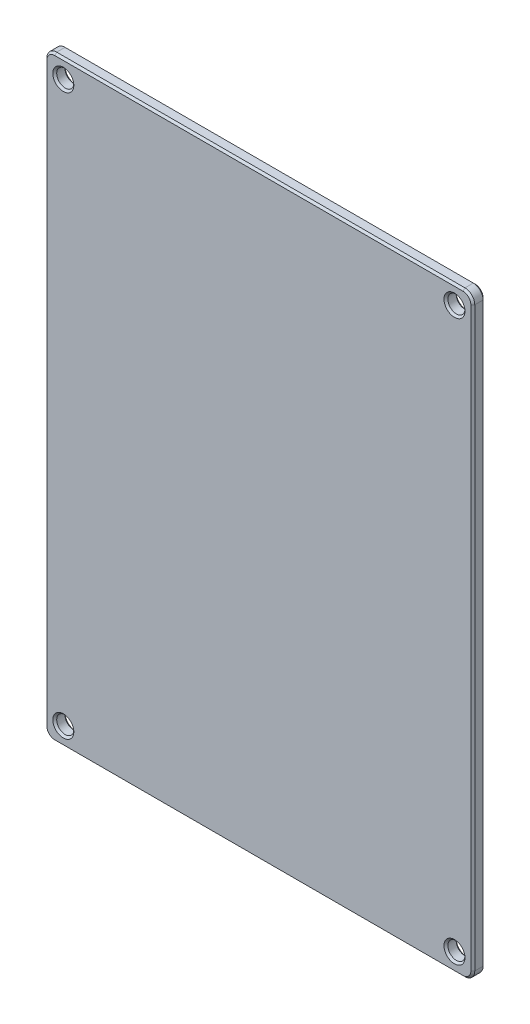
ISO-10303-21;
HEADER;
FILE_DESCRIPTION(('STEP AP214'),'2;1');
FILE_NAME('part.step','',(''),(''),'','','');
FILE_SCHEMA(('AUTOMOTIVE_DESIGN { 1 0 10303 214 1 1 1 1 }'));
ENDSEC;
DATA;
#1=APPLICATION_CONTEXT('core data for automotive mechanical design processes');
#2=APPLICATION_PROTOCOL_DEFINITION('international standard','automotive_design',2000,#1);
#3=PRODUCT_CONTEXT('',#1,'mechanical');
#4=PRODUCT('Part','Part','',(#3));
#5=PRODUCT_RELATED_PRODUCT_CATEGORY('part','',(#4));
#6=PRODUCT_DEFINITION_FORMATION('','',#4);
#7=PRODUCT_DEFINITION_CONTEXT('part definition',#1,'design');
#8=PRODUCT_DEFINITION('design','',#6,#7);
#9=PRODUCT_DEFINITION_SHAPE('','',#8);
#10=(LENGTH_UNIT() NAMED_UNIT(*) SI_UNIT(.MILLI.,.METRE.));
#11=(NAMED_UNIT(*) PLANE_ANGLE_UNIT() SI_UNIT($,.RADIAN.));
#12=(NAMED_UNIT(*) SI_UNIT($,.STERADIAN.) SOLID_ANGLE_UNIT());
#13=UNCERTAINTY_MEASURE_WITH_UNIT(LENGTH_MEASURE(1.E-05),#10,'distance_accuracy_value','');
#14=(GEOMETRIC_REPRESENTATION_CONTEXT(3) GLOBAL_UNCERTAINTY_ASSIGNED_CONTEXT((#13)) GLOBAL_UNIT_ASSIGNED_CONTEXT((#10,
#11,#12)) REPRESENTATION_CONTEXT('',''));
#15=CARTESIAN_POINT('',(0.,0.,0.));
#16=DIRECTION('',(0.,0.,1.));
#17=DIRECTION('',(1.,0.,0.));
#18=AXIS2_PLACEMENT_3D('',#15,#16,#17);
#19=CARTESIAN_POINT('',(41.75,-59.,2.5));
#20=DIRECTION('',(0.,0.,-1.));
#21=DIRECTION('',(-1.,0.,0.));
#22=AXIS2_PLACEMENT_3D('',#19,#20,#21);
#23=PLANE('',#22);
#24=CARTESIAN_POINT('',(40.,-57.25,2.5));
#25=DIRECTION('',(0.,0.,-1.));
#26=DIRECTION('',(-1.,0.,0.));
#27=AXIS2_PLACEMENT_3D('',#24,#25,#26);
#28=CIRCLE('',#27,2.15000000000003);
#29=CARTESIAN_POINT('',(37.85,-57.25,2.5));
#30=VERTEX_POINT('',#29);
#31=EDGE_CURVE('E198',#30,#30,#28,.T.);
#32=ORIENTED_EDGE('',*,*,#31,.T.);
#33=EDGE_LOOP('',(#32));
#34=FACE_BOUND('',#33,.T.);
#35=CARTESIAN_POINT('',(40.,57.25,2.5));
#36=DIRECTION('',(0.,0.,-1.));
#37=DIRECTION('',(-1.,0.,0.));
#38=AXIS2_PLACEMENT_3D('',#35,#36,#37);
#39=CIRCLE('',#38,2.15000000000003);
#40=CARTESIAN_POINT('',(37.85,57.25,2.5));
#41=VERTEX_POINT('',#40);
#42=EDGE_CURVE('E193',#41,#41,#39,.T.);
#43=ORIENTED_EDGE('',*,*,#42,.T.);
#44=EDGE_LOOP('',(#43));
#45=FACE_BOUND('',#44,.T.);
#46=CARTESIAN_POINT('',(-40.,-57.25,2.5));
#47=DIRECTION('',(0.,0.,-1.));
#48=DIRECTION('',(-1.,0.,0.));
#49=AXIS2_PLACEMENT_3D('',#46,#47,#48);
#50=CIRCLE('',#49,2.15000000000003);
#51=CARTESIAN_POINT('',(-42.15,-57.25,2.5));
#52=VERTEX_POINT('',#51);
#53=EDGE_CURVE('E183',#52,#52,#50,.T.);
#54=ORIENTED_EDGE('',*,*,#53,.T.);
#55=EDGE_LOOP('',(#54));
#56=FACE_BOUND('',#55,.T.);
#57=CARTESIAN_POINT('',(-40.,57.25,2.5));
#58=DIRECTION('',(0.,0.,-1.));
#59=DIRECTION('',(-1.,0.,0.));
#60=AXIS2_PLACEMENT_3D('',#57,#58,#59);
#61=CIRCLE('',#60,2.14999999999999);
#62=CARTESIAN_POINT('',(-42.15,57.25,2.5));
#63=VERTEX_POINT('',#62);
#64=EDGE_CURVE('E185',#63,#63,#61,.T.);
#65=ORIENTED_EDGE('',*,*,#64,.T.);
#66=EDGE_LOOP('',(#65));
#67=FACE_BOUND('',#66,.T.);
#68=CARTESIAN_POINT('',(-41.7499999999999,-59.,2.5));
#69=DIRECTION('',(0.,0.,-1.));
#70=DIRECTION('',(-1.,0.,0.));
#71=AXIS2_PLACEMENT_3D('',#68,#69,#70);
#72=CIRCLE('',#71,1.59999999999998);
#73=CARTESIAN_POINT('',(-43.3499999999999,-59.,2.5));
#74=VERTEX_POINT('',#73);
#75=CARTESIAN_POINT('',(-41.7499999999999,-60.6,2.5));
#76=VERTEX_POINT('',#75);
#77=EDGE_CURVE('E179',#74,#76,#72,.F.);
#78=ORIENTED_EDGE('',*,*,#77,.T.);
#79=DIRECTION('',(1.,0.,0.));
#80=VECTOR('',#79,1.);
#81=CARTESIAN_POINT('',(41.75,-60.5999999999999,2.5));
#82=LINE('',#81,#80);
#83=CARTESIAN_POINT('',(41.75,-60.5999999999999,2.5));
#84=VERTEX_POINT('',#83);
#85=EDGE_CURVE('E165',#76,#84,#82,.T.);
#86=ORIENTED_EDGE('',*,*,#85,.T.);
#87=CARTESIAN_POINT('',(41.75,-59.,2.5));
#88=DIRECTION('',(0.,0.,-1.));
#89=DIRECTION('',(-1.,0.,0.));
#90=AXIS2_PLACEMENT_3D('',#87,#88,#89);
#91=CIRCLE('',#90,1.59999999999996);
#92=CARTESIAN_POINT('',(43.35,-59.,2.5));
#93=VERTEX_POINT('',#92);
#94=EDGE_CURVE('E168',#84,#93,#91,.F.);
#95=ORIENTED_EDGE('',*,*,#94,.T.);
#96=DIRECTION('',(0.,1.,0.));
#97=VECTOR('',#96,1.);
#98=CARTESIAN_POINT('',(43.35,-59.,2.5));
#99=LINE('',#98,#97);
#100=CARTESIAN_POINT('',(43.35,59.,2.5));
#101=VERTEX_POINT('',#100);
#102=EDGE_CURVE('E176',#93,#101,#99,.T.);
#103=ORIENTED_EDGE('',*,*,#102,.T.);
#104=CARTESIAN_POINT('',(41.75,59.,2.5));
#105=DIRECTION('',(0.,0.,-1.));
#106=DIRECTION('',(-1.,0.,0.));
#107=AXIS2_PLACEMENT_3D('',#104,#105,#106);
#108=CIRCLE('',#107,1.59999999999998);
#109=CARTESIAN_POINT('',(41.75,60.6,2.5));
#110=VERTEX_POINT('',#109);
#111=EDGE_CURVE('E357',#101,#110,#108,.F.);
#112=ORIENTED_EDGE('',*,*,#111,.T.);
#113=DIRECTION('',(-1.,0.,0.));
#114=VECTOR('',#113,1.);
#115=CARTESIAN_POINT('',(41.75,60.6,2.5));
#116=LINE('',#115,#114);
#117=CARTESIAN_POINT('',(-41.75,60.6,2.5));
#118=VERTEX_POINT('',#117);
#119=EDGE_CURVE('E363',#110,#118,#116,.T.);
#120=ORIENTED_EDGE('',*,*,#119,.T.);
#121=CARTESIAN_POINT('',(-41.75,59.,2.5));
#122=DIRECTION('',(0.,0.,-1.));
#123=DIRECTION('',(-1.,0.,0.));
#124=AXIS2_PLACEMENT_3D('',#121,#122,#123);
#125=CIRCLE('',#124,1.59999999999998);
#126=CARTESIAN_POINT('',(-43.3499999999999,59.,2.5));
#127=VERTEX_POINT('',#126);
#128=EDGE_CURVE('E361',#118,#127,#125,.F.);
#129=ORIENTED_EDGE('',*,*,#128,.T.);
#130=DIRECTION('',(0.,-1.,0.));
#131=VECTOR('',#130,1.);
#132=CARTESIAN_POINT('',(-43.3499999999999,-59.,2.5));
#133=LINE('',#132,#131);
#134=EDGE_CURVE('E190',#127,#74,#133,.T.);
#135=ORIENTED_EDGE('',*,*,#134,.T.);
#136=EDGE_LOOP('',(#78,#86,#95,#103,#112,#120,#129,#135));
#137=FACE_BOUND('',#136,.T.);
#138=ADVANCED_FACE('F41',(#34,#45,#56,#67,#137),#23,.F.);
#139=CARTESIAN_POINT('',(41.75,-59.,0.));
#140=DIRECTION('',(0.,0.,-1.));
#141=DIRECTION('',(-1.,0.,0.));
#142=AXIS2_PLACEMENT_3D('',#139,#140,#141);
#143=PLANE('',#142);
#144=CARTESIAN_POINT('',(40.,-57.25,0.));
#145=DIRECTION('',(0.,0.,-1.));
#146=DIRECTION('',(-1.,0.,0.));
#147=AXIS2_PLACEMENT_3D('',#144,#145,#146);
#148=CIRCLE('',#147,2.15000000000001);
#149=CARTESIAN_POINT('',(37.85,-57.25,0.));
#150=VERTEX_POINT('',#149);
#151=EDGE_CURVE('E11',#150,#150,#148,.F.);
#152=ORIENTED_EDGE('',*,*,#151,.T.);
#153=EDGE_LOOP('',(#152));
#154=FACE_BOUND('',#153,.T.);
#155=CARTESIAN_POINT('',(-40.,-57.25,0.));
#156=DIRECTION('',(0.,0.,-1.));
#157=DIRECTION('',(-1.,0.,0.));
#158=AXIS2_PLACEMENT_3D('',#155,#156,#157);
#159=CIRCLE('',#158,2.15000000000001);
#160=CARTESIAN_POINT('',(-42.15,-57.25,0.));
#161=VERTEX_POINT('',#160);
#162=EDGE_CURVE('E51',#161,#161,#159,.F.);
#163=ORIENTED_EDGE('',*,*,#162,.T.);
#164=EDGE_LOOP('',(#163));
#165=FACE_BOUND('',#164,.T.);
#166=CARTESIAN_POINT('',(41.75,59.,0.));
#167=DIRECTION('',(0.,0.,-1.));
#168=DIRECTION('',(-1.,0.,0.));
#169=AXIS2_PLACEMENT_3D('',#166,#167,#168);
#170=CIRCLE('',#169,1.60000000000002);
#171=CARTESIAN_POINT('',(41.75,60.6,0.));
#172=VERTEX_POINT('',#171);
#173=CARTESIAN_POINT('',(43.35,59.,0.));
#174=VERTEX_POINT('',#173);
#175=EDGE_CURVE('E56',#172,#174,#170,.T.);
#176=ORIENTED_EDGE('',*,*,#175,.T.);
#177=DIRECTION('',(0.,-1.,0.));
#178=VECTOR('',#177,1.);
#179=CARTESIAN_POINT('',(43.35,-59.,0.));
#180=LINE('',#179,#178);
#181=CARTESIAN_POINT('',(43.35,-59.,0.));
#182=VERTEX_POINT('',#181);
#183=EDGE_CURVE('E270',#174,#182,#180,.T.);
#184=ORIENTED_EDGE('',*,*,#183,.T.);
#185=CARTESIAN_POINT('',(41.75,-59.,0.));
#186=DIRECTION('',(0.,0.,-1.));
#187=DIRECTION('',(-1.,0.,0.));
#188=AXIS2_PLACEMENT_3D('',#185,#186,#187);
#189=CIRCLE('',#188,1.6);
#190=CARTESIAN_POINT('',(41.75,-60.6,0.));
#191=VERTEX_POINT('',#190);
#192=EDGE_CURVE('E254',#182,#191,#189,.T.);
#193=ORIENTED_EDGE('',*,*,#192,.T.);
#194=DIRECTION('',(-1.,0.,0.));
#195=VECTOR('',#194,1.);
#196=CARTESIAN_POINT('',(-41.7499999999999,-60.6,0.));
#197=LINE('',#196,#195);
#198=CARTESIAN_POINT('',(-41.7499999999999,-60.6,0.));
#199=VERTEX_POINT('',#198);
#200=EDGE_CURVE('E260',#191,#199,#197,.T.);
#201=ORIENTED_EDGE('',*,*,#200,.T.);
#202=CARTESIAN_POINT('',(-41.7499999999999,-59.,0.));
#203=DIRECTION('',(0.,0.,-1.));
#204=DIRECTION('',(-1.,0.,0.));
#205=AXIS2_PLACEMENT_3D('',#202,#203,#204);
#206=CIRCLE('',#205,1.60000000000002);
#207=CARTESIAN_POINT('',(-43.35,-59.,0.));
#208=VERTEX_POINT('',#207);
#209=EDGE_CURVE('E259',#199,#208,#206,.T.);
#210=ORIENTED_EDGE('',*,*,#209,.T.);
#211=DIRECTION('',(0.,1.,0.));
#212=VECTOR('',#211,1.);
#213=CARTESIAN_POINT('',(-43.35,59.,0.));
#214=LINE('',#213,#212);
#215=CARTESIAN_POINT('',(-43.35,59.,0.));
#216=VERTEX_POINT('',#215);
#217=EDGE_CURVE('E261',#208,#216,#214,.T.);
#218=ORIENTED_EDGE('',*,*,#217,.T.);
#219=CARTESIAN_POINT('',(-41.75,59.,0.));
#220=DIRECTION('',(0.,0.,-1.));
#221=DIRECTION('',(-1.,0.,0.));
#222=AXIS2_PLACEMENT_3D('',#219,#220,#221);
#223=CIRCLE('',#222,1.60000000000002);
#224=CARTESIAN_POINT('',(-41.75,60.6,0.));
#225=VERTEX_POINT('',#224);
#226=EDGE_CURVE('E263',#216,#225,#223,.T.);
#227=ORIENTED_EDGE('',*,*,#226,.T.);
#228=DIRECTION('',(1.,0.,0.));
#229=VECTOR('',#228,1.);
#230=CARTESIAN_POINT('',(41.75,60.6,0.));
#231=LINE('',#230,#229);
#232=EDGE_CURVE('E63',#225,#172,#231,.T.);
#233=ORIENTED_EDGE('',*,*,#232,.T.);
#234=EDGE_LOOP('',(#176,#184,#193,#201,#210,#218,#227,#233));
#235=FACE_BOUND('',#234,.T.);
#236=CARTESIAN_POINT('',(-40.,57.25,0.));
#237=DIRECTION('',(0.,0.,-1.));
#238=DIRECTION('',(-1.,0.,0.));
#239=AXIS2_PLACEMENT_3D('',#236,#237,#238);
#240=CIRCLE('',#239,2.14999999999997);
#241=CARTESIAN_POINT('',(-42.15,57.25,0.));
#242=VERTEX_POINT('',#241);
#243=EDGE_CURVE('E252',#242,#242,#240,.F.);
#244=ORIENTED_EDGE('',*,*,#243,.T.);
#245=EDGE_LOOP('',(#244));
#246=FACE_BOUND('',#245,.T.);
#247=CARTESIAN_POINT('',(40.,57.25,0.));
#248=DIRECTION('',(0.,0.,-1.));
#249=DIRECTION('',(-1.,0.,0.));
#250=AXIS2_PLACEMENT_3D('',#247,#248,#249);
#251=CIRCLE('',#250,2.15000000000001);
#252=CARTESIAN_POINT('',(37.85,57.25,0.));
#253=VERTEX_POINT('',#252);
#254=EDGE_CURVE('E247',#253,#253,#251,.F.);
#255=ORIENTED_EDGE('',*,*,#254,.T.);
#256=EDGE_LOOP('',(#255));
#257=FACE_BOUND('',#256,.T.);
#258=ADVANCED_FACE('F321',(#154,#165,#235,#246,#257),#143,.T.);
#259=CARTESIAN_POINT('',(41.75,-59.,2.5));
#260=DIRECTION('',(0.,0.,-1.));
#261=DIRECTION('',(-1.,0.,0.));
#262=AXIS2_PLACEMENT_3D('',#259,#260,#261);
#263=CYLINDRICAL_SURFACE('',#262,1.99999999999999);
#264=DIRECTION('',(0.,0.,-1.));
#265=VECTOR('',#264,1.);
#266=CARTESIAN_POINT('',(43.75,-59.,2.5));
#267=LINE('',#266,#265);
#268=CARTESIAN_POINT('',(43.75,-59.,2.09999999999997));
#269=VERTEX_POINT('',#268);
#270=CARTESIAN_POINT('',(43.75,-59.,0.400000000000011));
#271=VERTEX_POINT('',#270);
#272=EDGE_CURVE('E339',#269,#271,#267,.T.);
#273=ORIENTED_EDGE('',*,*,#272,.F.);
#274=CARTESIAN_POINT('',(41.75,-59.,2.09999999999997));
#275=DIRECTION('',(0.,0.,-1.));
#276=DIRECTION('',(-1.,0.,0.));
#277=AXIS2_PLACEMENT_3D('',#274,#275,#276);
#278=CIRCLE('',#277,1.99999999999999);
#279=CARTESIAN_POINT('',(41.75,-61.,2.09999999999997));
#280=VERTEX_POINT('',#279);
#281=EDGE_CURVE('E250',#269,#280,#278,.T.);
#282=ORIENTED_EDGE('',*,*,#281,.T.);
#283=DIRECTION('',(0.,0.,-1.));
#284=VECTOR('',#283,1.);
#285=CARTESIAN_POINT('',(41.75,-61.,2.5));
#286=LINE('',#285,#284);
#287=CARTESIAN_POINT('',(41.75,-61.,0.400000000000011));
#288=VERTEX_POINT('',#287);
#289=EDGE_CURVE('E288',#280,#288,#286,.T.);
#290=ORIENTED_EDGE('',*,*,#289,.T.);
#291=CARTESIAN_POINT('',(41.75,-59.,0.400000000000011));
#292=DIRECTION('',(0.,0.,-1.));
#293=DIRECTION('',(-1.,0.,0.));
#294=AXIS2_PLACEMENT_3D('',#291,#292,#293);
#295=CIRCLE('',#294,1.99999999999999);
#296=EDGE_CURVE('E244',#288,#271,#295,.F.);
#297=ORIENTED_EDGE('',*,*,#296,.T.);
#298=EDGE_LOOP('',(#273,#282,#290,#297));
#299=FACE_BOUND('',#298,.T.);
#300=ADVANCED_FACE('F338',(#299),#263,.T.);
#301=CARTESIAN_POINT('',(43.75,59.,2.5));
#302=DIRECTION('',(-1.,0.,0.));
#303=DIRECTION('',(0.,-1.,0.));
#304=AXIS2_PLACEMENT_3D('',#301,#302,#303);
#305=PLANE('',#304);
#306=DIRECTION('',(0.,0.,-1.));
#307=VECTOR('',#306,1.);
#308=CARTESIAN_POINT('',(43.75,59.,2.5));
#309=LINE('',#308,#307);
#310=CARTESIAN_POINT('',(43.75,59.,2.09999999999997));
#311=VERTEX_POINT('',#310);
#312=CARTESIAN_POINT('',(43.75,59.,0.400000000000011));
#313=VERTEX_POINT('',#312);
#314=EDGE_CURVE('E346',#311,#313,#309,.T.);
#315=ORIENTED_EDGE('',*,*,#314,.F.);
#316=DIRECTION('',(0.,-1.,0.));
#317=VECTOR('',#316,1.);
#318=CARTESIAN_POINT('',(43.75,59.,2.09999999999997));
#319=LINE('',#318,#317);
#320=EDGE_CURVE('E242',#311,#269,#319,.T.);
#321=ORIENTED_EDGE('',*,*,#320,.T.);
#322=ORIENTED_EDGE('',*,*,#272,.T.);
#323=DIRECTION('',(0.,1.,0.));
#324=VECTOR('',#323,1.);
#325=CARTESIAN_POINT('',(43.75,59.,0.400000000000011));
#326=LINE('',#325,#324);
#327=EDGE_CURVE('E238',#271,#313,#326,.T.);
#328=ORIENTED_EDGE('',*,*,#327,.T.);
#329=EDGE_LOOP('',(#315,#321,#322,#328));
#330=FACE_BOUND('',#329,.T.);
#331=ADVANCED_FACE('F342',(#330),#305,.F.);
#332=CARTESIAN_POINT('',(41.75,59.,2.5));
#333=DIRECTION('',(0.,0.,-1.));
#334=DIRECTION('',(-1.,0.,0.));
#335=AXIS2_PLACEMENT_3D('',#332,#333,#334);
#336=CYLINDRICAL_SURFACE('',#335,2.00000000000001);
#337=DIRECTION('',(0.,0.,-1.));
#338=VECTOR('',#337,1.);
#339=CARTESIAN_POINT('',(41.75,61.,2.5));
#340=LINE('',#339,#338);
#341=CARTESIAN_POINT('',(41.75,61.,2.09999999999997));
#342=VERTEX_POINT('',#341);
#343=CARTESIAN_POINT('',(41.75,61.,0.400000000000011));
#344=VERTEX_POINT('',#343);
#345=EDGE_CURVE('E355',#342,#344,#340,.T.);
#346=ORIENTED_EDGE('',*,*,#345,.F.);
#347=CARTESIAN_POINT('',(41.75,59.,2.09999999999997));
#348=DIRECTION('',(0.,0.,-1.));
#349=DIRECTION('',(-1.,0.,0.));
#350=AXIS2_PLACEMENT_3D('',#347,#348,#349);
#351=CIRCLE('',#350,2.00000000000001);
#352=EDGE_CURVE('E236',#342,#311,#351,.T.);
#353=ORIENTED_EDGE('',*,*,#352,.T.);
#354=ORIENTED_EDGE('',*,*,#314,.T.);
#355=CARTESIAN_POINT('',(41.75,59.,0.400000000000011));
#356=DIRECTION('',(0.,0.,-1.));
#357=DIRECTION('',(-1.,0.,0.));
#358=AXIS2_PLACEMENT_3D('',#355,#356,#357);
#359=CIRCLE('',#358,2.00000000000001);
#360=EDGE_CURVE('E237',#313,#344,#359,.F.);
#361=ORIENTED_EDGE('',*,*,#360,.T.);
#362=EDGE_LOOP('',(#346,#353,#354,#361));
#363=FACE_BOUND('',#362,.T.);
#364=ADVANCED_FACE('F447',(#363),#336,.T.);
#365=CARTESIAN_POINT('',(41.75,61.,2.5));
#366=DIRECTION('',(0.,-1.,0.));
#367=DIRECTION('',(0.,0.,-1.));
#368=AXIS2_PLACEMENT_3D('',#365,#366,#367);
#369=PLANE('',#368);
#370=DIRECTION('',(0.,0.,-1.));
#371=VECTOR('',#370,1.);
#372=CARTESIAN_POINT('',(-41.75,61.,2.5));
#373=LINE('',#372,#371);
#374=CARTESIAN_POINT('',(-41.75,61.,2.09999999999997));
#375=VERTEX_POINT('',#374);
#376=CARTESIAN_POINT('',(-41.75,61.,0.400000000000011));
#377=VERTEX_POINT('',#376);
#378=EDGE_CURVE('E391',#375,#377,#373,.T.);
#379=ORIENTED_EDGE('',*,*,#378,.F.);
#380=DIRECTION('',(1.,0.,0.));
#381=VECTOR('',#380,1.);
#382=CARTESIAN_POINT('',(41.75,61.,2.09999999999997));
#383=LINE('',#382,#381);
#384=EDGE_CURVE('E232',#375,#342,#383,.T.);
#385=ORIENTED_EDGE('',*,*,#384,.T.);
#386=ORIENTED_EDGE('',*,*,#345,.T.);
#387=DIRECTION('',(-1.,0.,0.));
#388=VECTOR('',#387,1.);
#389=CARTESIAN_POINT('',(-41.75,61.,0.400000000000011));
#390=LINE('',#389,#388);
#391=EDGE_CURVE('E235',#344,#377,#390,.T.);
#392=ORIENTED_EDGE('',*,*,#391,.T.);
#393=EDGE_LOOP('',(#379,#385,#386,#392));
#394=FACE_BOUND('',#393,.T.);
#395=ADVANCED_FACE('F398',(#394),#369,.F.);
#396=CARTESIAN_POINT('',(-41.75,59.,2.5));
#397=DIRECTION('',(0.,0.,-1.));
#398=DIRECTION('',(-1.,0.,0.));
#399=AXIS2_PLACEMENT_3D('',#396,#397,#398);
#400=CYLINDRICAL_SURFACE('',#399,2.00000000000001);
#401=DIRECTION('',(0.,0.,-1.));
#402=VECTOR('',#401,1.);
#403=CARTESIAN_POINT('',(-43.75,59.,2.5));
#404=LINE('',#403,#402);
#405=CARTESIAN_POINT('',(-43.75,59.,2.09999999999997));
#406=VERTEX_POINT('',#405);
#407=CARTESIAN_POINT('',(-43.75,59.,0.400000000000011));
#408=VERTEX_POINT('',#407);
#409=EDGE_CURVE('E384',#406,#408,#404,.T.);
#410=ORIENTED_EDGE('',*,*,#409,.F.);
#411=CARTESIAN_POINT('',(-41.75,59.,2.09999999999997));
#412=DIRECTION('',(0.,0.,-1.));
#413=DIRECTION('',(-1.,0.,0.));
#414=AXIS2_PLACEMENT_3D('',#411,#412,#413);
#415=CIRCLE('',#414,2.00000000000001);
#416=EDGE_CURVE('E229',#406,#375,#415,.T.);
#417=ORIENTED_EDGE('',*,*,#416,.T.);
#418=ORIENTED_EDGE('',*,*,#378,.T.);
#419=CARTESIAN_POINT('',(-41.75,59.,0.400000000000011));
#420=DIRECTION('',(0.,0.,-1.));
#421=DIRECTION('',(-1.,0.,0.));
#422=AXIS2_PLACEMENT_3D('',#419,#420,#421);
#423=CIRCLE('',#422,2.00000000000001);
#424=EDGE_CURVE('E227',#377,#408,#423,.F.);
#425=ORIENTED_EDGE('',*,*,#424,.T.);
#426=EDGE_LOOP('',(#410,#417,#418,#425));
#427=FACE_BOUND('',#426,.T.);
#428=ADVANCED_FACE('F442',(#427),#400,.T.);
#429=CARTESIAN_POINT('',(-43.75,59.,2.5));
#430=DIRECTION('',(1.,0.,0.));
#431=DIRECTION('',(0.,1.,0.));
#432=AXIS2_PLACEMENT_3D('',#429,#430,#431);
#433=PLANE('',#432);
#434=DIRECTION('',(0.,0.,-1.));
#435=VECTOR('',#434,1.);
#436=CARTESIAN_POINT('',(-43.75,-59.,2.5));
#437=LINE('',#436,#435);
#438=CARTESIAN_POINT('',(-43.75,-59.,2.09999999999997));
#439=VERTEX_POINT('',#438);
#440=CARTESIAN_POINT('',(-43.75,-59.,0.400000000000011));
#441=VERTEX_POINT('',#440);
#442=EDGE_CURVE('E382',#439,#441,#437,.T.);
#443=ORIENTED_EDGE('',*,*,#442,.F.);
#444=DIRECTION('',(0.,1.,0.));
#445=VECTOR('',#444,1.);
#446=CARTESIAN_POINT('',(-43.75,59.,2.09999999999997));
#447=LINE('',#446,#445);
#448=EDGE_CURVE('E226',#439,#406,#447,.T.);
#449=ORIENTED_EDGE('',*,*,#448,.T.);
#450=ORIENTED_EDGE('',*,*,#409,.T.);
#451=DIRECTION('',(0.,-1.,0.));
#452=VECTOR('',#451,1.);
#453=CARTESIAN_POINT('',(-43.75,-59.,0.400000000000011));
#454=LINE('',#453,#452);
#455=EDGE_CURVE('E221',#408,#441,#454,.T.);
#456=ORIENTED_EDGE('',*,*,#455,.T.);
#457=EDGE_LOOP('',(#443,#449,#450,#456));
#458=FACE_BOUND('',#457,.T.);
#459=ADVANCED_FACE('F437',(#458),#433,.F.);
#460=CARTESIAN_POINT('',(-41.7499999999999,-59.,2.5));
#461=DIRECTION('',(0.,0.,-1.));
#462=DIRECTION('',(-1.,0.,0.));
#463=AXIS2_PLACEMENT_3D('',#460,#461,#462);
#464=CYLINDRICAL_SURFACE('',#463,2.00000000000001);
#465=DIRECTION('',(0.,0.,-1.));
#466=VECTOR('',#465,1.);
#467=CARTESIAN_POINT('',(-41.7499999999999,-61.,2.5));
#468=LINE('',#467,#466);
#469=CARTESIAN_POINT('',(-41.7499999999999,-61.,2.09999999999997));
#470=VERTEX_POINT('',#469);
#471=CARTESIAN_POINT('',(-41.7499999999999,-61.,0.400000000000011));
#472=VERTEX_POINT('',#471);
#473=EDGE_CURVE('E381',#470,#472,#468,.T.);
#474=ORIENTED_EDGE('',*,*,#473,.F.);
#475=CARTESIAN_POINT('',(-41.7499999999999,-59.,2.09999999999997));
#476=DIRECTION('',(0.,0.,-1.));
#477=DIRECTION('',(-1.,0.,0.));
#478=AXIS2_PLACEMENT_3D('',#475,#476,#477);
#479=CIRCLE('',#478,2.00000000000001);
#480=EDGE_CURVE('E225',#470,#439,#479,.T.);
#481=ORIENTED_EDGE('',*,*,#480,.T.);
#482=ORIENTED_EDGE('',*,*,#442,.T.);
#483=CARTESIAN_POINT('',(-41.7499999999999,-59.,0.400000000000011));
#484=DIRECTION('',(0.,0.,-1.));
#485=DIRECTION('',(-1.,0.,0.));
#486=AXIS2_PLACEMENT_3D('',#483,#484,#485);
#487=CIRCLE('',#486,2.00000000000001);
#488=EDGE_CURVE('E219',#441,#472,#487,.F.);
#489=ORIENTED_EDGE('',*,*,#488,.T.);
#490=EDGE_LOOP('',(#474,#481,#482,#489));
#491=FACE_BOUND('',#490,.T.);
#492=ADVANCED_FACE('F385',(#491),#464,.T.);
#493=CARTESIAN_POINT('',(41.75,-61.,2.5));
#494=DIRECTION('',(0.,1.,0.));
#495=DIRECTION('',(-1.,0.,0.));
#496=AXIS2_PLACEMENT_3D('',#493,#494,#495);
#497=PLANE('',#496);
#498=ORIENTED_EDGE('',*,*,#289,.F.);
#499=DIRECTION('',(-1.,0.,0.));
#500=VECTOR('',#499,1.);
#501=CARTESIAN_POINT('',(41.75,-61.,2.09999999999997));
#502=LINE('',#501,#500);
#503=EDGE_CURVE('E163',#280,#470,#502,.T.);
#504=ORIENTED_EDGE('',*,*,#503,.T.);
#505=ORIENTED_EDGE('',*,*,#473,.T.);
#506=DIRECTION('',(1.,0.,0.));
#507=VECTOR('',#506,1.);
#508=CARTESIAN_POINT('',(41.75,-61.,0.400000000000011));
#509=LINE('',#508,#507);
#510=EDGE_CURVE('E220',#472,#288,#509,.T.);
#511=ORIENTED_EDGE('',*,*,#510,.T.);
#512=EDGE_LOOP('',(#498,#504,#505,#511));
#513=FACE_BOUND('',#512,.T.);
#514=ADVANCED_FACE('F379',(#513),#497,.F.);
#515=CARTESIAN_POINT('',(-40.,57.25,2.5));
#516=DIRECTION('',(0.,0.,-1.));
#517=DIRECTION('',(-1.,0.,0.));
#518=AXIS2_PLACEMENT_3D('',#515,#516,#517);
#519=CYLINDRICAL_SURFACE('',#518,1.75);
#520=CARTESIAN_POINT('',(-40.,57.25,2.10000000000003));
#521=DIRECTION('',(0.,0.,-1.));
#522=DIRECTION('',(-1.,0.,0.));
#523=AXIS2_PLACEMENT_3D('',#520,#521,#522);
#524=CIRCLE('',#523,1.75);
#525=CARTESIAN_POINT('',(-41.75,57.25,2.10000000000003));
#526=VERTEX_POINT('',#525);
#527=EDGE_CURVE('E212',#526,#526,#524,.F.);
#528=ORIENTED_EDGE('',*,*,#527,.T.);
#529=EDGE_LOOP('',(#528));
#530=FACE_BOUND('',#529,.T.);
#531=CARTESIAN_POINT('',(-40.,57.25,0.39999999999996));
#532=DIRECTION('',(0.,0.,-1.));
#533=DIRECTION('',(-1.,0.,0.));
#534=AXIS2_PLACEMENT_3D('',#531,#532,#533);
#535=CIRCLE('',#534,1.75);
#536=CARTESIAN_POINT('',(-41.75,57.25,0.39999999999996));
#537=VERTEX_POINT('',#536);
#538=EDGE_CURVE('E211',#537,#537,#535,.T.);
#539=ORIENTED_EDGE('',*,*,#538,.T.);
#540=EDGE_LOOP('',(#539));
#541=FACE_BOUND('',#540,.T.);
#542=ADVANCED_FACE('F431',(#530,#541),#519,.F.);
#543=CARTESIAN_POINT('',(-40.,-57.25,2.5));
#544=DIRECTION('',(0.,0.,-1.));
#545=DIRECTION('',(-1.,0.,0.));
#546=AXIS2_PLACEMENT_3D('',#543,#544,#545);
#547=CYLINDRICAL_SURFACE('',#546,1.75);
#548=CARTESIAN_POINT('',(-40.,-57.25,2.09999999999999));
#549=DIRECTION('',(0.,0.,-1.));
#550=DIRECTION('',(-1.,0.,0.));
#551=AXIS2_PLACEMENT_3D('',#548,#549,#550);
#552=CIRCLE('',#551,1.75);
#553=CARTESIAN_POINT('',(-41.75,-57.25,2.09999999999999));
#554=VERTEX_POINT('',#553);
#555=EDGE_CURVE('E208',#554,#554,#552,.F.);
#556=ORIENTED_EDGE('',*,*,#555,.T.);
#557=EDGE_LOOP('',(#556));
#558=FACE_BOUND('',#557,.T.);
#559=CARTESIAN_POINT('',(-40.,-57.25,0.400000000000001));
#560=DIRECTION('',(0.,0.,-1.));
#561=DIRECTION('',(-1.,0.,0.));
#562=AXIS2_PLACEMENT_3D('',#559,#560,#561);
#563=CIRCLE('',#562,1.75);
#564=CARTESIAN_POINT('',(-41.75,-57.25,0.400000000000001));
#565=VERTEX_POINT('',#564);
#566=EDGE_CURVE('E202',#565,#565,#563,.T.);
#567=ORIENTED_EDGE('',*,*,#566,.T.);
#568=EDGE_LOOP('',(#567));
#569=FACE_BOUND('',#568,.T.);
#570=ADVANCED_FACE('F551',(#558,#569),#547,.F.);
#571=CARTESIAN_POINT('',(40.,57.25,2.5));
#572=DIRECTION('',(0.,0.,-1.));
#573=DIRECTION('',(-1.,0.,0.));
#574=AXIS2_PLACEMENT_3D('',#571,#572,#573);
#575=CYLINDRICAL_SURFACE('',#574,1.75);
#576=CARTESIAN_POINT('',(40.,57.25,2.09999999999999));
#577=DIRECTION('',(0.,0.,-1.));
#578=DIRECTION('',(-1.,0.,0.));
#579=AXIS2_PLACEMENT_3D('',#576,#577,#578);
#580=CIRCLE('',#579,1.75);
#581=CARTESIAN_POINT('',(38.25,57.25,2.09999999999999));
#582=VERTEX_POINT('',#581);
#583=EDGE_CURVE('E205',#582,#582,#580,.F.);
#584=ORIENTED_EDGE('',*,*,#583,.T.);
#585=EDGE_LOOP('',(#584));
#586=FACE_BOUND('',#585,.T.);
#587=CARTESIAN_POINT('',(40.,57.25,0.400000000000001));
#588=DIRECTION('',(0.,0.,-1.));
#589=DIRECTION('',(-1.,0.,0.));
#590=AXIS2_PLACEMENT_3D('',#587,#588,#589);
#591=CIRCLE('',#590,1.75);
#592=CARTESIAN_POINT('',(38.25,57.25,0.400000000000001));
#593=VERTEX_POINT('',#592);
#594=EDGE_CURVE('E200',#593,#593,#591,.T.);
#595=ORIENTED_EDGE('',*,*,#594,.T.);
#596=EDGE_LOOP('',(#595));
#597=FACE_BOUND('',#596,.T.);
#598=ADVANCED_FACE('F556',(#586,#597),#575,.F.);
#599=CARTESIAN_POINT('',(40.,-57.25,2.5));
#600=DIRECTION('',(0.,0.,-1.));
#601=DIRECTION('',(-1.,0.,0.));
#602=AXIS2_PLACEMENT_3D('',#599,#600,#601);
#603=CYLINDRICAL_SURFACE('',#602,1.75000000000001);
#604=CARTESIAN_POINT('',(40.,-57.25,2.09999999999999));
#605=DIRECTION('',(0.,0.,-1.));
#606=DIRECTION('',(-1.,0.,0.));
#607=AXIS2_PLACEMENT_3D('',#604,#605,#606);
#608=CIRCLE('',#607,1.75000000000001);
#609=CARTESIAN_POINT('',(38.25,-57.25,2.09999999999999));
#610=VERTEX_POINT('',#609);
#611=EDGE_CURVE('E180',#610,#610,#608,.F.);
#612=ORIENTED_EDGE('',*,*,#611,.T.);
#613=EDGE_LOOP('',(#612));
#614=FACE_BOUND('',#613,.T.);
#615=CARTESIAN_POINT('',(40.,-57.25,0.399999999999995));
#616=DIRECTION('',(0.,0.,-1.));
#617=DIRECTION('',(-1.,0.,0.));
#618=AXIS2_PLACEMENT_3D('',#615,#616,#617);
#619=CIRCLE('',#618,1.75000000000001);
#620=CARTESIAN_POINT('',(38.25,-57.25,0.399999999999995));
#621=VERTEX_POINT('',#620);
#622=EDGE_CURVE('E350',#621,#621,#619,.T.);
#623=ORIENTED_EDGE('',*,*,#622,.T.);
#624=EDGE_LOOP('',(#623));
#625=FACE_BOUND('',#624,.T.);
#626=ADVANCED_FACE('F462',(#614,#625),#603,.F.);
#627=CARTESIAN_POINT('',(40.,-57.25,2.09999999999999));
#628=DIRECTION('',(0.,0.,1.));
#629=DIRECTION('',(1.,0.,0.));
#630=AXIS2_PLACEMENT_3D('',#627,#628,#629);
#631=CONICAL_SURFACE('',#630,1.75000000000001,0.785398163397459);
#632=ORIENTED_EDGE('',*,*,#31,.F.);
#633=EDGE_LOOP('',(#632));
#634=FACE_BOUND('',#633,.T.);
#635=ORIENTED_EDGE('',*,*,#611,.F.);
#636=EDGE_LOOP('',(#635));
#637=FACE_BOUND('',#636,.T.);
#638=ADVANCED_FACE('F457',(#634,#637),#631,.F.);
#639=CARTESIAN_POINT('',(40.,57.25,2.09999999999999));
#640=DIRECTION('',(0.,0.,1.));
#641=DIRECTION('',(1.,0.,0.));
#642=AXIS2_PLACEMENT_3D('',#639,#640,#641);
#643=CONICAL_SURFACE('',#642,1.75,0.785398163397459);
#644=ORIENTED_EDGE('',*,*,#42,.F.);
#645=EDGE_LOOP('',(#644));
#646=FACE_BOUND('',#645,.T.);
#647=ORIENTED_EDGE('',*,*,#583,.F.);
#648=EDGE_LOOP('',(#647));
#649=FACE_BOUND('',#648,.T.);
#650=ADVANCED_FACE('F465',(#646,#649),#643,.F.);
#651=CARTESIAN_POINT('',(-40.,-57.25,2.09999999999999));
#652=DIRECTION('',(0.,0.,1.));
#653=DIRECTION('',(1.,0.,0.));
#654=AXIS2_PLACEMENT_3D('',#651,#652,#653);
#655=CONICAL_SURFACE('',#654,1.75,0.785398163397459);
#656=ORIENTED_EDGE('',*,*,#53,.F.);
#657=EDGE_LOOP('',(#656));
#658=FACE_BOUND('',#657,.T.);
#659=ORIENTED_EDGE('',*,*,#555,.F.);
#660=EDGE_LOOP('',(#659));
#661=FACE_BOUND('',#660,.T.);
#662=ADVANCED_FACE('F469',(#658,#661),#655,.F.);
#663=CARTESIAN_POINT('',(-40.,57.25,2.10000000000003));
#664=DIRECTION('',(0.,0.,1.));
#665=DIRECTION('',(1.,0.,0.));
#666=AXIS2_PLACEMENT_3D('',#663,#664,#665);
#667=CONICAL_SURFACE('',#666,1.75,0.785398163397459);
#668=ORIENTED_EDGE('',*,*,#64,.F.);
#669=EDGE_LOOP('',(#668));
#670=FACE_BOUND('',#669,.T.);
#671=ORIENTED_EDGE('',*,*,#527,.F.);
#672=EDGE_LOOP('',(#671));
#673=FACE_BOUND('',#672,.T.);
#674=ADVANCED_FACE('F480',(#670,#673),#667,.F.);
#675=CARTESIAN_POINT('',(41.75,60.6,2.5));
#676=DIRECTION('',(0.,-0.707106781186541,-0.707106781186554));
#677=DIRECTION('',(-1.,0.,0.));
#678=AXIS2_PLACEMENT_3D('',#675,#676,#677);
#679=PLANE('',#678);
#680=DIRECTION('',(0.,-0.707106781186554,0.707106781186541));
#681=VECTOR('',#680,1.);
#682=CARTESIAN_POINT('',(41.75,61.,2.09999999999997));
#683=LINE('',#682,#681);
#684=EDGE_CURVE('E285',#342,#110,#683,.T.);
#685=ORIENTED_EDGE('',*,*,#684,.F.);
#686=ORIENTED_EDGE('',*,*,#384,.F.);
#687=DIRECTION('',(0.,0.707106781186554,-0.707106781186541));
#688=VECTOR('',#687,1.);
#689=CARTESIAN_POINT('',(-41.75,60.6,2.5));
#690=LINE('',#689,#688);
#691=EDGE_CURVE('E284',#118,#375,#690,.T.);
#692=ORIENTED_EDGE('',*,*,#691,.F.);
#693=ORIENTED_EDGE('',*,*,#119,.F.);
#694=EDGE_LOOP('',(#685,#686,#692,#693));
#695=FACE_BOUND('',#694,.T.);
#696=ADVANCED_FACE('F482',(#695),#679,.F.);
#697=CARTESIAN_POINT('',(-41.75,59.,2.5));
#698=DIRECTION('',(0.,0.,-1.));
#699=DIRECTION('',(-1.,0.,0.));
#700=AXIS2_PLACEMENT_3D('',#697,#698,#699);
#701=CONICAL_SURFACE('',#700,1.59999999999998,0.785398163397457);
#702=ORIENTED_EDGE('',*,*,#691,.T.);
#703=ORIENTED_EDGE('',*,*,#416,.F.);
#704=DIRECTION('',(-0.707106781186554,0.,-0.707106781186541));
#705=VECTOR('',#704,1.);
#706=CARTESIAN_POINT('',(-43.3499999999999,59.,2.5));
#707=LINE('',#706,#705);
#708=EDGE_CURVE('E276',#127,#406,#707,.T.);
#709=ORIENTED_EDGE('',*,*,#708,.F.);
#710=ORIENTED_EDGE('',*,*,#128,.F.);
#711=EDGE_LOOP('',(#702,#703,#709,#710));
#712=FACE_BOUND('',#711,.T.);
#713=ADVANCED_FACE('F525',(#712),#701,.T.);
#714=CARTESIAN_POINT('',(41.75,59.,2.5));
#715=DIRECTION('',(0.,0.,-1.));
#716=DIRECTION('',(-1.,0.,0.));
#717=AXIS2_PLACEMENT_3D('',#714,#715,#716);
#718=CONICAL_SURFACE('',#717,1.59999999999998,0.785398163397457);
#719=ORIENTED_EDGE('',*,*,#684,.T.);
#720=ORIENTED_EDGE('',*,*,#111,.F.);
#721=DIRECTION('',(-0.707106781186554,0.,0.707106781186541));
#722=VECTOR('',#721,1.);
#723=CARTESIAN_POINT('',(43.75,59.,2.09999999999997));
#724=LINE('',#723,#722);
#725=EDGE_CURVE('E277',#311,#101,#724,.T.);
#726=ORIENTED_EDGE('',*,*,#725,.F.);
#727=ORIENTED_EDGE('',*,*,#352,.F.);
#728=EDGE_LOOP('',(#719,#720,#726,#727));
#729=FACE_BOUND('',#728,.T.);
#730=ADVANCED_FACE('F516',(#729),#718,.T.);
#731=CARTESIAN_POINT('',(-43.3499999999999,-59.,2.5));
#732=DIRECTION('',(0.707106781186541,0.,-0.707106781186554));
#733=DIRECTION('',(0.,-1.,0.));
#734=AXIS2_PLACEMENT_3D('',#731,#732,#733);
#735=PLANE('',#734);
#736=ORIENTED_EDGE('',*,*,#708,.T.);
#737=ORIENTED_EDGE('',*,*,#448,.F.);
#738=DIRECTION('',(-0.707106781186554,0.,-0.707106781186541));
#739=VECTOR('',#738,1.);
#740=CARTESIAN_POINT('',(-43.3499999999999,-59.,2.5));
#741=LINE('',#740,#739);
#742=EDGE_CURVE('E272',#74,#439,#741,.T.);
#743=ORIENTED_EDGE('',*,*,#742,.F.);
#744=ORIENTED_EDGE('',*,*,#134,.F.);
#745=EDGE_LOOP('',(#736,#737,#743,#744));
#746=FACE_BOUND('',#745,.T.);
#747=ADVANCED_FACE('F367',(#746),#735,.F.);
#748=CARTESIAN_POINT('',(43.35,-59.,2.5));
#749=DIRECTION('',(-0.707106781186541,0.,-0.707106781186554));
#750=DIRECTION('',(0.,1.,0.));
#751=AXIS2_PLACEMENT_3D('',#748,#749,#750);
#752=PLANE('',#751);
#753=ORIENTED_EDGE('',*,*,#725,.T.);
#754=ORIENTED_EDGE('',*,*,#102,.F.);
#755=DIRECTION('',(-0.707106781186554,0.,0.707106781186541));
#756=VECTOR('',#755,1.);
#757=CARTESIAN_POINT('',(43.75,-59.,2.09999999999997));
#758=LINE('',#757,#756);
#759=EDGE_CURVE('E172',#269,#93,#758,.T.);
#760=ORIENTED_EDGE('',*,*,#759,.F.);
#761=ORIENTED_EDGE('',*,*,#320,.F.);
#762=EDGE_LOOP('',(#753,#754,#760,#761));
#763=FACE_BOUND('',#762,.T.);
#764=ADVANCED_FACE('F503',(#763),#752,.F.);
#765=CARTESIAN_POINT('',(-41.7499999999999,-59.,2.5));
#766=DIRECTION('',(0.,0.,-1.));
#767=DIRECTION('',(-1.,0.,0.));
#768=AXIS2_PLACEMENT_3D('',#765,#766,#767);
#769=CONICAL_SURFACE('',#768,1.59999999999998,0.785398163397457);
#770=ORIENTED_EDGE('',*,*,#742,.T.);
#771=ORIENTED_EDGE('',*,*,#480,.F.);
#772=DIRECTION('',(0.,-0.707106781186554,-0.707106781186541));
#773=VECTOR('',#772,1.);
#774=CARTESIAN_POINT('',(-41.7499999999999,-60.6,2.5));
#775=LINE('',#774,#773);
#776=EDGE_CURVE('E170',#76,#470,#775,.T.);
#777=ORIENTED_EDGE('',*,*,#776,.F.);
#778=ORIENTED_EDGE('',*,*,#77,.F.);
#779=EDGE_LOOP('',(#770,#771,#777,#778));
#780=FACE_BOUND('',#779,.T.);
#781=ADVANCED_FACE('F373',(#780),#769,.T.);
#782=CARTESIAN_POINT('',(41.75,-59.,2.5));
#783=DIRECTION('',(0.,0.,-1.));
#784=DIRECTION('',(-1.,0.,0.));
#785=AXIS2_PLACEMENT_3D('',#782,#783,#784);
#786=CONICAL_SURFACE('',#785,1.59999999999996,0.785398163397457);
#787=ORIENTED_EDGE('',*,*,#759,.T.);
#788=ORIENTED_EDGE('',*,*,#94,.F.);
#789=DIRECTION('',(0.,0.707106781186554,0.707106781186541));
#790=VECTOR('',#789,1.);
#791=CARTESIAN_POINT('',(41.75,-61.,2.09999999999997));
#792=LINE('',#791,#790);
#793=EDGE_CURVE('E158',#280,#84,#792,.T.);
#794=ORIENTED_EDGE('',*,*,#793,.F.);
#795=ORIENTED_EDGE('',*,*,#281,.F.);
#796=EDGE_LOOP('',(#787,#788,#794,#795));
#797=FACE_BOUND('',#796,.T.);
#798=ADVANCED_FACE('F171',(#797),#786,.T.);
#799=CARTESIAN_POINT('',(41.75,-60.5999999999999,2.5));
#800=DIRECTION('',(0.,0.707106781186541,-0.707106781186554));
#801=DIRECTION('',(1.,0.,0.));
#802=AXIS2_PLACEMENT_3D('',#799,#800,#801);
#803=PLANE('',#802);
#804=ORIENTED_EDGE('',*,*,#776,.T.);
#805=ORIENTED_EDGE('',*,*,#503,.F.);
#806=ORIENTED_EDGE('',*,*,#793,.T.);
#807=ORIENTED_EDGE('',*,*,#85,.F.);
#808=EDGE_LOOP('',(#804,#805,#806,#807));
#809=FACE_BOUND('',#808,.T.);
#810=ADVANCED_FACE('F159',(#809),#803,.F.);
#811=CARTESIAN_POINT('',(40.,-57.25,0.));
#812=DIRECTION('',(0.,0.,-1.));
#813=DIRECTION('',(-1.,0.,0.));
#814=AXIS2_PLACEMENT_3D('',#811,#812,#813);
#815=CONICAL_SURFACE('',#814,2.15000000000001,0.785398163397458);
#816=ORIENTED_EDGE('',*,*,#622,.F.);
#817=EDGE_LOOP('',(#816));
#818=FACE_BOUND('',#817,.T.);
#819=ORIENTED_EDGE('',*,*,#151,.F.);
#820=EDGE_LOOP('',(#819));
#821=FACE_BOUND('',#820,.T.);
#822=ADVANCED_FACE('F492',(#818,#821),#815,.F.);
#823=CARTESIAN_POINT('',(-40.,-57.25,0.));
#824=DIRECTION('',(0.,0.,-1.));
#825=DIRECTION('',(-1.,0.,0.));
#826=AXIS2_PLACEMENT_3D('',#823,#824,#825);
#827=CONICAL_SURFACE('',#826,2.15000000000001,0.785398163397458);
#828=ORIENTED_EDGE('',*,*,#566,.F.);
#829=EDGE_LOOP('',(#828));
#830=FACE_BOUND('',#829,.T.);
#831=ORIENTED_EDGE('',*,*,#162,.F.);
#832=EDGE_LOOP('',(#831));
#833=FACE_BOUND('',#832,.T.);
#834=ADVANCED_FACE('F538',(#830,#833),#827,.F.);
#835=CARTESIAN_POINT('',(-43.75,59.,0.400000000000011));
#836=DIRECTION('',(-0.707106781186566,0.,-0.707106781186529));
#837=DIRECTION('',(0.,1.,0.));
#838=AXIS2_PLACEMENT_3D('',#835,#836,#837);
#839=PLANE('',#838);
#840=DIRECTION('',(-0.707106781186529,0.,0.707106781186566));
#841=VECTOR('',#840,1.);
#842=CARTESIAN_POINT('',(-43.35,59.,0.));
#843=LINE('',#842,#841);
#844=EDGE_CURVE('E302',#216,#408,#843,.T.);
#845=ORIENTED_EDGE('',*,*,#844,.F.);
#846=ORIENTED_EDGE('',*,*,#217,.F.);
#847=DIRECTION('',(0.707106781186529,0.,-0.707106781186566));
#848=VECTOR('',#847,1.);
#849=CARTESIAN_POINT('',(-43.75,-59.,0.400000000000011));
#850=LINE('',#849,#848);
#851=EDGE_CURVE('E46',#441,#208,#850,.T.);
#852=ORIENTED_EDGE('',*,*,#851,.F.);
#853=ORIENTED_EDGE('',*,*,#455,.F.);
#854=EDGE_LOOP('',(#845,#846,#852,#853));
#855=FACE_BOUND('',#854,.T.);
#856=ADVANCED_FACE('F319',(#855),#839,.T.);
#857=CARTESIAN_POINT('',(-41.7499999999999,-59.,0.400000000000011));
#858=DIRECTION('',(0.,0.,1.));
#859=DIRECTION('',(1.,0.,0.));
#860=AXIS2_PLACEMENT_3D('',#857,#858,#859);
#861=CONICAL_SURFACE('',#860,2.00000000000001,0.785398163397422);
#862=ORIENTED_EDGE('',*,*,#851,.T.);
#863=ORIENTED_EDGE('',*,*,#209,.F.);
#864=DIRECTION('',(0.,0.707106781186529,-0.707106781186566));
#865=VECTOR('',#864,1.);
#866=CARTESIAN_POINT('',(-41.7499999999999,-61.,0.400000000000011));
#867=LINE('',#866,#865);
#868=EDGE_CURVE('E305',#472,#199,#867,.T.);
#869=ORIENTED_EDGE('',*,*,#868,.F.);
#870=ORIENTED_EDGE('',*,*,#488,.F.);
#871=EDGE_LOOP('',(#862,#863,#869,#870));
#872=FACE_BOUND('',#871,.T.);
#873=ADVANCED_FACE('F312',(#872),#861,.T.);
#874=CARTESIAN_POINT('',(-41.75,59.,0.400000000000011));
#875=DIRECTION('',(0.,0.,1.));
#876=DIRECTION('',(1.,0.,0.));
#877=AXIS2_PLACEMENT_3D('',#874,#875,#876);
#878=CONICAL_SURFACE('',#877,2.00000000000001,0.785398163397422);
#879=ORIENTED_EDGE('',*,*,#844,.T.);
#880=ORIENTED_EDGE('',*,*,#424,.F.);
#881=DIRECTION('',(0.,0.707106781186529,0.707106781186566));
#882=VECTOR('',#881,1.);
#883=CARTESIAN_POINT('',(-41.75,60.6,0.));
#884=LINE('',#883,#882);
#885=EDGE_CURVE('E298',#225,#377,#884,.T.);
#886=ORIENTED_EDGE('',*,*,#885,.F.);
#887=ORIENTED_EDGE('',*,*,#226,.F.);
#888=EDGE_LOOP('',(#879,#880,#886,#887));
#889=FACE_BOUND('',#888,.T.);
#890=ADVANCED_FACE('F664',(#889),#878,.T.);
#891=CARTESIAN_POINT('',(41.75,-61.,0.400000000000011));
#892=DIRECTION('',(0.,-0.707106781186566,-0.707106781186529));
#893=DIRECTION('',(-1.,0.,0.));
#894=AXIS2_PLACEMENT_3D('',#891,#892,#893);
#895=PLANE('',#894);
#896=ORIENTED_EDGE('',*,*,#868,.T.);
#897=ORIENTED_EDGE('',*,*,#200,.F.);
#898=DIRECTION('',(0.,0.707106781186529,-0.707106781186566));
#899=VECTOR('',#898,1.);
#900=CARTESIAN_POINT('',(41.75,-61.,0.400000000000011));
#901=LINE('',#900,#899);
#902=EDGE_CURVE('E296',#288,#191,#901,.T.);
#903=ORIENTED_EDGE('',*,*,#902,.F.);
#904=ORIENTED_EDGE('',*,*,#510,.F.);
#905=EDGE_LOOP('',(#896,#897,#903,#904));
#906=FACE_BOUND('',#905,.T.);
#907=ADVANCED_FACE('F327',(#906),#895,.T.);
#908=CARTESIAN_POINT('',(41.75,61.,0.400000000000011));
#909=DIRECTION('',(0.,0.707106781186566,-0.707106781186529));
#910=DIRECTION('',(1.,0.,0.));
#911=AXIS2_PLACEMENT_3D('',#908,#909,#910);
#912=PLANE('',#911);
#913=ORIENTED_EDGE('',*,*,#885,.T.);
#914=ORIENTED_EDGE('',*,*,#391,.F.);
#915=DIRECTION('',(0.,0.707106781186529,0.707106781186566));
#916=VECTOR('',#915,1.);
#917=CARTESIAN_POINT('',(41.75,60.6,0.));
#918=LINE('',#917,#916);
#919=EDGE_CURVE('E291',#172,#344,#918,.T.);
#920=ORIENTED_EDGE('',*,*,#919,.F.);
#921=ORIENTED_EDGE('',*,*,#232,.F.);
#922=EDGE_LOOP('',(#913,#914,#920,#921));
#923=FACE_BOUND('',#922,.T.);
#924=ADVANCED_FACE('F401',(#923),#912,.T.);
#925=CARTESIAN_POINT('',(41.75,-59.,0.400000000000011));
#926=DIRECTION('',(0.,0.,1.));
#927=DIRECTION('',(1.,0.,0.));
#928=AXIS2_PLACEMENT_3D('',#925,#926,#927);
#929=CONICAL_SURFACE('',#928,1.99999999999999,0.785398163397422);
#930=ORIENTED_EDGE('',*,*,#902,.T.);
#931=ORIENTED_EDGE('',*,*,#192,.F.);
#932=DIRECTION('',(-0.707106781186529,0.,-0.707106781186566));
#933=VECTOR('',#932,1.);
#934=CARTESIAN_POINT('',(43.75,-59.,0.400000000000011));
#935=LINE('',#934,#933);
#936=EDGE_CURVE('E292',#271,#182,#935,.T.);
#937=ORIENTED_EDGE('',*,*,#936,.F.);
#938=ORIENTED_EDGE('',*,*,#296,.F.);
#939=EDGE_LOOP('',(#930,#931,#937,#938));
#940=FACE_BOUND('',#939,.T.);
#941=ADVANCED_FACE('F335',(#940),#929,.T.);
#942=CARTESIAN_POINT('',(41.75,59.,0.400000000000011));
#943=DIRECTION('',(0.,0.,1.));
#944=DIRECTION('',(1.,0.,0.));
#945=AXIS2_PLACEMENT_3D('',#942,#943,#944);
#946=CONICAL_SURFACE('',#945,2.00000000000001,0.785398163397422);
#947=ORIENTED_EDGE('',*,*,#919,.T.);
#948=ORIENTED_EDGE('',*,*,#360,.F.);
#949=DIRECTION('',(0.707106781186529,0.,0.707106781186566));
#950=VECTOR('',#949,1.);
#951=CARTESIAN_POINT('',(43.35,59.,0.));
#952=LINE('',#951,#950);
#953=EDGE_CURVE('E287',#174,#313,#952,.T.);
#954=ORIENTED_EDGE('',*,*,#953,.F.);
#955=ORIENTED_EDGE('',*,*,#175,.F.);
#956=EDGE_LOOP('',(#947,#948,#954,#955));
#957=FACE_BOUND('',#956,.T.);
#958=ADVANCED_FACE('F406',(#957),#946,.T.);
#959=CARTESIAN_POINT('',(43.75,59.,0.400000000000011));
#960=DIRECTION('',(0.707106781186566,0.,-0.707106781186529));
#961=DIRECTION('',(0.,-1.,0.));
#962=AXIS2_PLACEMENT_3D('',#959,#960,#961);
#963=PLANE('',#962);
#964=ORIENTED_EDGE('',*,*,#936,.T.);
#965=ORIENTED_EDGE('',*,*,#183,.F.);
#966=ORIENTED_EDGE('',*,*,#953,.T.);
#967=ORIENTED_EDGE('',*,*,#327,.F.);
#968=EDGE_LOOP('',(#964,#965,#966,#967));
#969=FACE_BOUND('',#968,.T.);
#970=ADVANCED_FACE('F408',(#969),#963,.T.);
#971=CARTESIAN_POINT('',(-40.,57.25,0.));
#972=DIRECTION('',(0.,0.,-1.));
#973=DIRECTION('',(-1.,0.,0.));
#974=AXIS2_PLACEMENT_3D('',#971,#972,#973);
#975=CONICAL_SURFACE('',#974,2.14999999999997,0.785398163397458);
#976=ORIENTED_EDGE('',*,*,#538,.F.);
#977=EDGE_LOOP('',(#976));
#978=FACE_BOUND('',#977,.T.);
#979=ORIENTED_EDGE('',*,*,#243,.F.);
#980=EDGE_LOOP('',(#979));
#981=FACE_BOUND('',#980,.T.);
#982=ADVANCED_FACE('F411',(#978,#981),#975,.F.);
#983=CARTESIAN_POINT('',(40.,57.25,0.));
#984=DIRECTION('',(0.,0.,-1.));
#985=DIRECTION('',(-1.,0.,0.));
#986=AXIS2_PLACEMENT_3D('',#983,#984,#985);
#987=CONICAL_SURFACE('',#986,2.15000000000001,0.785398163397458);
#988=ORIENTED_EDGE('',*,*,#594,.F.);
#989=EDGE_LOOP('',(#988));
#990=FACE_BOUND('',#989,.T.);
#991=ORIENTED_EDGE('',*,*,#254,.F.);
#992=EDGE_LOOP('',(#991));
#993=FACE_BOUND('',#992,.T.);
#994=ADVANCED_FACE('F42',(#990,#993),#987,.F.);
#995=CLOSED_SHELL('',(#138,#258,#300,#331,#364,#395,#428,#459,#492,#514,#542,#570,#598,#626,
#638,#650,#662,#674,#696,#713,#730,#747,#764,#781,#798,#810,#822,#834,#856,#873,#890,#907,#924,
#941,#958,#970,#982,#994));
#996=MANIFOLD_SOLID_BREP('B2',#995);
#997=ADVANCED_BREP_SHAPE_REPRESENTATION('',(#18,#996),#14);
#998=SHAPE_DEFINITION_REPRESENTATION(#9,#997);
ENDSEC;
END-ISO-10303-21;
